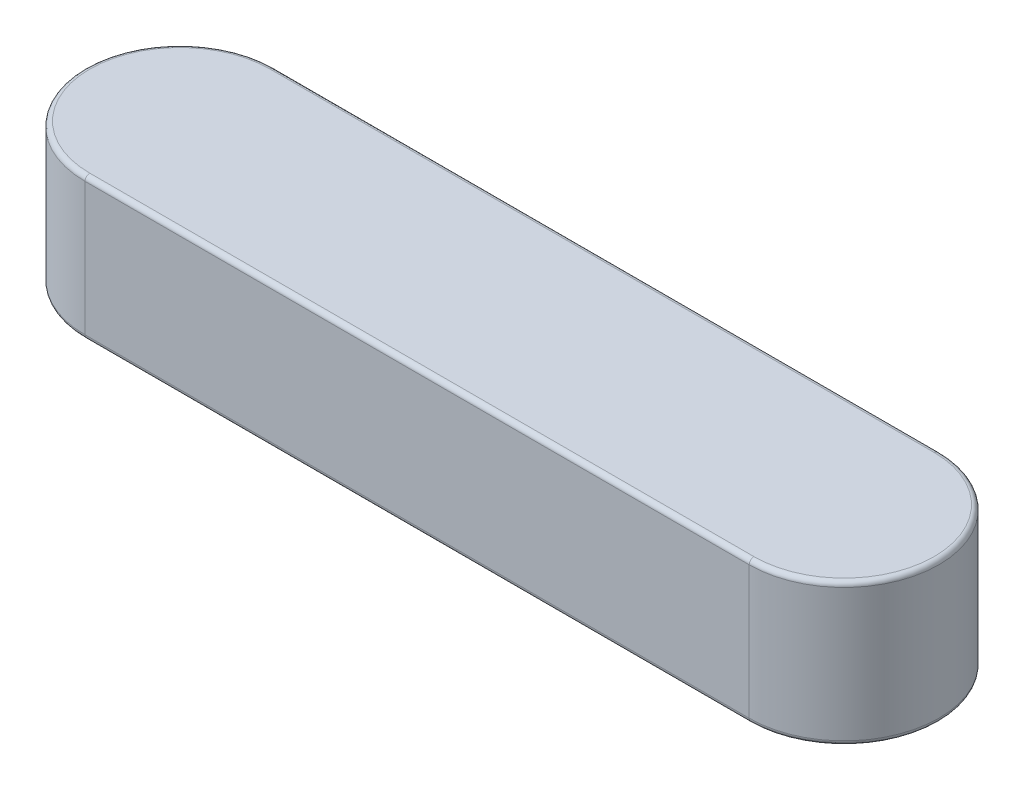
ISO-10303-21;
HEADER;
FILE_DESCRIPTION(('STEP AP214'),'2;1');
FILE_NAME('part.step','',(''),(''),'','','');
FILE_SCHEMA(('AUTOMOTIVE_DESIGN { 1 0 10303 214 1 1 1 1 }'));
ENDSEC;
DATA;
#1=APPLICATION_CONTEXT('core data for automotive mechanical design processes');
#2=APPLICATION_PROTOCOL_DEFINITION('international standard','automotive_design',2000,#1);
#3=PRODUCT_CONTEXT('',#1,'mechanical');
#4=PRODUCT('Part','Part','',(#3));
#5=PRODUCT_RELATED_PRODUCT_CATEGORY('part','',(#4));
#6=PRODUCT_DEFINITION_FORMATION('','',#4);
#7=PRODUCT_DEFINITION_CONTEXT('part definition',#1,'design');
#8=PRODUCT_DEFINITION('design','',#6,#7);
#9=PRODUCT_DEFINITION_SHAPE('','',#8);
#10=(LENGTH_UNIT() NAMED_UNIT(*) SI_UNIT(.MILLI.,.METRE.));
#11=(NAMED_UNIT(*) PLANE_ANGLE_UNIT() SI_UNIT($,.RADIAN.));
#12=(NAMED_UNIT(*) SI_UNIT($,.STERADIAN.) SOLID_ANGLE_UNIT());
#13=UNCERTAINTY_MEASURE_WITH_UNIT(LENGTH_MEASURE(1.E-05),#10,'distance_accuracy_value','');
#14=(GEOMETRIC_REPRESENTATION_CONTEXT(3) GLOBAL_UNCERTAINTY_ASSIGNED_CONTEXT((#13)) GLOBAL_UNIT_ASSIGNED_CONTEXT((#10,
#11,#12)) REPRESENTATION_CONTEXT('',''));
#15=CARTESIAN_POINT('',(0.,0.,0.));
#16=DIRECTION('',(0.,0.,1.));
#17=DIRECTION('',(1.,0.,0.));
#18=AXIS2_PLACEMENT_3D('',#15,#16,#17);
#19=CARTESIAN_POINT('',(-13.6061348843651,6.,0.));
#20=DIRECTION('',(0.,-1.,0.));
#21=DIRECTION('',(0.,0.,-1.));
#22=AXIS2_PLACEMENT_3D('',#19,#20,#21);
#23=CYLINDRICAL_SURFACE('',#22,4.);
#24=DIRECTION('',(0.,-1.,0.));
#25=VECTOR('',#24,1.);
#26=CARTESIAN_POINT('',(-13.6061348843651,6.,4.));
#27=LINE('',#26,#25);
#28=CARTESIAN_POINT('',(-13.6061348843651,5.8,4.));
#29=VERTEX_POINT('',#28);
#30=CARTESIAN_POINT('',(-13.6061348843651,0.2,4.));
#31=VERTEX_POINT('',#30);
#32=EDGE_CURVE('E126',#29,#31,#27,.T.);
#33=ORIENTED_EDGE('',*,*,#32,.F.);
#34=CARTESIAN_POINT('',(-13.6061348843651,5.8,0.));
#35=DIRECTION('',(0.,1.,0.));
#36=DIRECTION('',(0.,0.,1.));
#37=AXIS2_PLACEMENT_3D('',#34,#35,#36);
#38=CIRCLE('',#37,4.);
#39=CARTESIAN_POINT('',(-13.6061348843651,5.8,-4.));
#40=VERTEX_POINT('',#39);
#41=EDGE_CURVE('E11',#29,#40,#38,.F.);
#42=ORIENTED_EDGE('',*,*,#41,.T.);
#43=DIRECTION('',(0.,-1.,0.));
#44=VECTOR('',#43,1.);
#45=CARTESIAN_POINT('',(-13.6061348843651,6.,-4.));
#46=LINE('',#45,#44);
#47=CARTESIAN_POINT('',(-13.6061348843651,0.2,-4.));
#48=VERTEX_POINT('',#47);
#49=EDGE_CURVE('E131',#40,#48,#46,.T.);
#50=ORIENTED_EDGE('',*,*,#49,.T.);
#51=CARTESIAN_POINT('',(-13.6061348843651,0.2,0.));
#52=DIRECTION('',(0.,1.,0.));
#53=DIRECTION('',(0.,0.,1.));
#54=AXIS2_PLACEMENT_3D('',#51,#52,#53);
#55=CIRCLE('',#54,4.);
#56=EDGE_CURVE('E49',#48,#31,#55,.T.);
#57=ORIENTED_EDGE('',*,*,#56,.T.);
#58=EDGE_LOOP('',(#33,#42,#50,#57));
#59=FACE_BOUND('',#58,.T.);
#60=ADVANCED_FACE('F39',(#59),#23,.T.);
#61=CARTESIAN_POINT('',(-13.6061348843651,6.,4.));
#62=DIRECTION('',(0.,0.,-1.));
#63=DIRECTION('',(-1.,0.,0.));
#64=AXIS2_PLACEMENT_3D('',#61,#62,#63);
#65=PLANE('',#64);
#66=ORIENTED_EDGE('',*,*,#32,.T.);
#67=DIRECTION('',(1.,0.,0.));
#68=VECTOR('',#67,1.);
#69=CARTESIAN_POINT('',(-13.6061348843651,0.2,4.));
#70=LINE('',#69,#68);
#71=CARTESIAN_POINT('',(14.393865115635,0.2,4.));
#72=VERTEX_POINT('',#71);
#73=EDGE_CURVE('E177',#31,#72,#70,.T.);
#74=ORIENTED_EDGE('',*,*,#73,.T.);
#75=DIRECTION('',(0.,-1.,0.));
#76=VECTOR('',#75,1.);
#77=CARTESIAN_POINT('',(14.393865115635,6.,4.));
#78=LINE('',#77,#76);
#79=CARTESIAN_POINT('',(14.393865115635,5.8,4.));
#80=VERTEX_POINT('',#79);
#81=EDGE_CURVE('E142',#80,#72,#78,.T.);
#82=ORIENTED_EDGE('',*,*,#81,.F.);
#83=DIRECTION('',(1.,0.,0.));
#84=VECTOR('',#83,1.);
#85=CARTESIAN_POINT('',(-13.6061348843651,5.8,4.));
#86=LINE('',#85,#84);
#87=EDGE_CURVE('E174',#80,#29,#86,.F.);
#88=ORIENTED_EDGE('',*,*,#87,.T.);
#89=EDGE_LOOP('',(#66,#74,#82,#88));
#90=FACE_BOUND('',#89,.T.);
#91=ADVANCED_FACE('F216',(#90),#65,.F.);
#92=CARTESIAN_POINT('',(14.3938651156349,6.,0.));
#93=DIRECTION('',(0.,-1.,0.));
#94=DIRECTION('',(0.,0.,-1.));
#95=AXIS2_PLACEMENT_3D('',#92,#93,#94);
#96=CYLINDRICAL_SURFACE('',#95,4.);
#97=ORIENTED_EDGE('',*,*,#81,.T.);
#98=CARTESIAN_POINT('',(14.3938651156349,0.2,0.));
#99=DIRECTION('',(0.,1.,0.));
#100=DIRECTION('',(0.,0.,1.));
#101=AXIS2_PLACEMENT_3D('',#98,#99,#100);
#102=CIRCLE('',#101,4.);
#103=CARTESIAN_POINT('',(14.393865115635,0.2,-4.));
#104=VERTEX_POINT('',#103);
#105=EDGE_CURVE('E171',#72,#104,#102,.T.);
#106=ORIENTED_EDGE('',*,*,#105,.T.);
#107=DIRECTION('',(0.,-1.,0.));
#108=VECTOR('',#107,1.);
#109=CARTESIAN_POINT('',(14.393865115635,6.,-4.));
#110=LINE('',#109,#108);
#111=CARTESIAN_POINT('',(14.393865115635,5.8,-4.));
#112=VERTEX_POINT('',#111);
#113=EDGE_CURVE('E137',#112,#104,#110,.T.);
#114=ORIENTED_EDGE('',*,*,#113,.F.);
#115=CARTESIAN_POINT('',(14.3938651156349,5.8,0.));
#116=DIRECTION('',(0.,1.,0.));
#117=DIRECTION('',(0.,0.,1.));
#118=AXIS2_PLACEMENT_3D('',#115,#116,#117);
#119=CIRCLE('',#118,4.);
#120=EDGE_CURVE('E168',#112,#80,#119,.F.);
#121=ORIENTED_EDGE('',*,*,#120,.T.);
#122=EDGE_LOOP('',(#97,#106,#114,#121));
#123=FACE_BOUND('',#122,.T.);
#124=ADVANCED_FACE('F213',(#123),#96,.T.);
#125=CARTESIAN_POINT('',(-13.6061348843651,6.,-4.));
#126=DIRECTION('',(0.,0.,1.));
#127=DIRECTION('',(1.,0.,0.));
#128=AXIS2_PLACEMENT_3D('',#125,#126,#127);
#129=PLANE('',#128);
#130=ORIENTED_EDGE('',*,*,#113,.T.);
#131=DIRECTION('',(-1.,0.,0.));
#132=VECTOR('',#131,1.);
#133=CARTESIAN_POINT('',(-13.6061348843651,0.2,-4.));
#134=LINE('',#133,#132);
#135=EDGE_CURVE('E125',#104,#48,#134,.T.);
#136=ORIENTED_EDGE('',*,*,#135,.T.);
#137=ORIENTED_EDGE('',*,*,#49,.F.);
#138=DIRECTION('',(-1.,0.,0.));
#139=VECTOR('',#138,1.);
#140=CARTESIAN_POINT('',(14.393865115635,5.8,-4.));
#141=LINE('',#140,#139);
#142=EDGE_CURVE('E118',#40,#112,#141,.F.);
#143=ORIENTED_EDGE('',*,*,#142,.T.);
#144=EDGE_LOOP('',(#130,#136,#137,#143));
#145=FACE_BOUND('',#144,.T.);
#146=ADVANCED_FACE('F134',(#145),#129,.F.);
#147=CARTESIAN_POINT('',(-13.6061348843651,6.,0.));
#148=DIRECTION('',(0.,1.,0.));
#149=DIRECTION('',(0.,0.,1.));
#150=AXIS2_PLACEMENT_3D('',#147,#148,#149);
#151=PLANE('',#150);
#152=DIRECTION('',(-1.,0.,0.));
#153=VECTOR('',#152,1.);
#154=CARTESIAN_POINT('',(-13.6061348843651,6.,-3.8));
#155=LINE('',#154,#153);
#156=CARTESIAN_POINT('',(14.393865115635,6.,-3.8));
#157=VERTEX_POINT('',#156);
#158=CARTESIAN_POINT('',(-13.6061348843651,6.,-3.8));
#159=VERTEX_POINT('',#158);
#160=EDGE_CURVE('E57',#157,#159,#155,.T.);
#161=ORIENTED_EDGE('',*,*,#160,.T.);
#162=CARTESIAN_POINT('',(-13.6061348843651,6.,0.));
#163=DIRECTION('',(0.,1.,0.));
#164=DIRECTION('',(0.,0.,1.));
#165=AXIS2_PLACEMENT_3D('',#162,#163,#164);
#166=CIRCLE('',#165,3.8);
#167=CARTESIAN_POINT('',(-13.6061348843651,6.,3.8));
#168=VERTEX_POINT('',#167);
#169=EDGE_CURVE('E111',#159,#168,#166,.T.);
#170=ORIENTED_EDGE('',*,*,#169,.T.);
#171=DIRECTION('',(1.,0.,0.));
#172=VECTOR('',#171,1.);
#173=CARTESIAN_POINT('',(14.393865115635,6.,3.8));
#174=LINE('',#173,#172);
#175=CARTESIAN_POINT('',(14.393865115635,6.,3.8));
#176=VERTEX_POINT('',#175);
#177=EDGE_CURVE('E180',#168,#176,#174,.T.);
#178=ORIENTED_EDGE('',*,*,#177,.T.);
#179=CARTESIAN_POINT('',(14.3938651156349,6.,0.));
#180=DIRECTION('',(0.,1.,0.));
#181=DIRECTION('',(0.,0.,1.));
#182=AXIS2_PLACEMENT_3D('',#179,#180,#181);
#183=CIRCLE('',#182,3.8);
#184=EDGE_CURVE('E62',#176,#157,#183,.T.);
#185=ORIENTED_EDGE('',*,*,#184,.T.);
#186=EDGE_LOOP('',(#161,#170,#178,#185));
#187=FACE_BOUND('',#186,.T.);
#188=ADVANCED_FACE('F309',(#187),#151,.T.);
#189=CARTESIAN_POINT('',(-13.6061348843651,0.,0.));
#190=DIRECTION('',(0.,1.,0.));
#191=DIRECTION('',(0.,0.,1.));
#192=AXIS2_PLACEMENT_3D('',#189,#190,#191);
#193=PLANE('',#192);
#194=CARTESIAN_POINT('',(-13.6061348843651,0.,0.));
#195=DIRECTION('',(0.,1.,0.));
#196=DIRECTION('',(0.,0.,1.));
#197=AXIS2_PLACEMENT_3D('',#194,#195,#196);
#198=CIRCLE('',#197,3.8);
#199=CARTESIAN_POINT('',(-13.6061348843651,0.,3.8));
#200=VERTEX_POINT('',#199);
#201=CARTESIAN_POINT('',(-13.6061348843651,0.,-3.8));
#202=VERTEX_POINT('',#201);
#203=EDGE_CURVE('E155',#200,#202,#198,.F.);
#204=ORIENTED_EDGE('',*,*,#203,.T.);
#205=DIRECTION('',(-1.,0.,0.));
#206=VECTOR('',#205,1.);
#207=CARTESIAN_POINT('',(-13.6061348843651,0.,-3.8));
#208=LINE('',#207,#206);
#209=CARTESIAN_POINT('',(14.393865115635,0.,-3.8));
#210=VERTEX_POINT('',#209);
#211=EDGE_CURVE('E164',#202,#210,#208,.F.);
#212=ORIENTED_EDGE('',*,*,#211,.T.);
#213=CARTESIAN_POINT('',(14.3938651156349,0.,0.));
#214=DIRECTION('',(0.,1.,0.));
#215=DIRECTION('',(0.,0.,1.));
#216=AXIS2_PLACEMENT_3D('',#213,#214,#215);
#217=CIRCLE('',#216,3.8);
#218=CARTESIAN_POINT('',(14.393865115635,0.,3.8));
#219=VERTEX_POINT('',#218);
#220=EDGE_CURVE('E161',#210,#219,#217,.F.);
#221=ORIENTED_EDGE('',*,*,#220,.T.);
#222=DIRECTION('',(1.,0.,0.));
#223=VECTOR('',#222,1.);
#224=CARTESIAN_POINT('',(-13.6061348843651,0.,3.8));
#225=LINE('',#224,#223);
#226=EDGE_CURVE('E158',#219,#200,#225,.F.);
#227=ORIENTED_EDGE('',*,*,#226,.T.);
#228=EDGE_LOOP('',(#204,#212,#221,#227));
#229=FACE_BOUND('',#228,.T.);
#230=ADVANCED_FACE('F230',(#229),#193,.F.);
#231=CARTESIAN_POINT('',(-13.6061348843651,0.2,3.8));
#232=DIRECTION('',(1.,0.,0.));
#233=DIRECTION('',(0.,0.,-1.));
#234=AXIS2_PLACEMENT_3D('',#231,#232,#233);
#235=CYLINDRICAL_SURFACE('',#234,0.2);
#236=CARTESIAN_POINT('',(-13.6061348843651,0.2,3.8));
#237=DIRECTION('',(-1.,0.,0.));
#238=DIRECTION('',(0.,0.,1.));
#239=AXIS2_PLACEMENT_3D('',#236,#237,#238);
#240=CIRCLE('',#239,0.2);
#241=EDGE_CURVE('E145',#200,#31,#240,.T.);
#242=ORIENTED_EDGE('',*,*,#241,.F.);
#243=ORIENTED_EDGE('',*,*,#226,.F.);
#244=CARTESIAN_POINT('',(14.393865115635,0.2,3.8));
#245=DIRECTION('',(1.,0.,0.));
#246=DIRECTION('',(0.,0.,-1.));
#247=AXIS2_PLACEMENT_3D('',#244,#245,#246);
#248=CIRCLE('',#247,0.2);
#249=EDGE_CURVE('E138',#72,#219,#248,.T.);
#250=ORIENTED_EDGE('',*,*,#249,.F.);
#251=ORIENTED_EDGE('',*,*,#73,.F.);
#252=EDGE_LOOP('',(#242,#243,#250,#251));
#253=FACE_BOUND('',#252,.T.);
#254=ADVANCED_FACE('F220',(#253),#235,.T.);
#255=CARTESIAN_POINT('',(14.3938651156349,0.2,0.));
#256=DIRECTION('',(0.,1.,0.));
#257=DIRECTION('',(0.,0.,1.));
#258=AXIS2_PLACEMENT_3D('',#255,#256,#257);
#259=TOROIDAL_SURFACE('',#258,3.8,0.2);
#260=ORIENTED_EDGE('',*,*,#249,.T.);
#261=ORIENTED_EDGE('',*,*,#220,.F.);
#262=CARTESIAN_POINT('',(14.393865115635,0.2,-3.8));
#263=DIRECTION('',(-1.,0.,0.));
#264=DIRECTION('',(0.,0.,1.));
#265=AXIS2_PLACEMENT_3D('',#262,#263,#264);
#266=CIRCLE('',#265,0.2);
#267=EDGE_CURVE('E194',#104,#210,#266,.T.);
#268=ORIENTED_EDGE('',*,*,#267,.F.);
#269=ORIENTED_EDGE('',*,*,#105,.F.);
#270=EDGE_LOOP('',(#260,#261,#268,#269));
#271=FACE_BOUND('',#270,.T.);
#272=ADVANCED_FACE('F236',(#271),#259,.T.);
#273=CARTESIAN_POINT('',(-13.6061348843651,0.2,0.));
#274=DIRECTION('',(0.,1.,0.));
#275=DIRECTION('',(0.,0.,1.));
#276=AXIS2_PLACEMENT_3D('',#273,#274,#275);
#277=TOROIDAL_SURFACE('',#276,3.8,0.2);
#278=ORIENTED_EDGE('',*,*,#241,.T.);
#279=ORIENTED_EDGE('',*,*,#56,.F.);
#280=CARTESIAN_POINT('',(-13.6061348843651,0.2,-3.8));
#281=DIRECTION('',(1.,0.,0.));
#282=DIRECTION('',(0.,0.,-1.));
#283=AXIS2_PLACEMENT_3D('',#280,#281,#282);
#284=CIRCLE('',#283,0.2);
#285=EDGE_CURVE('E191',#202,#48,#284,.T.);
#286=ORIENTED_EDGE('',*,*,#285,.F.);
#287=ORIENTED_EDGE('',*,*,#203,.F.);
#288=EDGE_LOOP('',(#278,#279,#286,#287));
#289=FACE_BOUND('',#288,.T.);
#290=ADVANCED_FACE('F226',(#289),#277,.T.);
#291=CARTESIAN_POINT('',(-13.6061348843651,0.2,-3.8));
#292=DIRECTION('',(-1.,0.,0.));
#293=DIRECTION('',(0.,0.,1.));
#294=AXIS2_PLACEMENT_3D('',#291,#292,#293);
#295=CYLINDRICAL_SURFACE('',#294,0.2);
#296=ORIENTED_EDGE('',*,*,#267,.T.);
#297=ORIENTED_EDGE('',*,*,#211,.F.);
#298=ORIENTED_EDGE('',*,*,#285,.T.);
#299=ORIENTED_EDGE('',*,*,#135,.F.);
#300=EDGE_LOOP('',(#296,#297,#298,#299));
#301=FACE_BOUND('',#300,.T.);
#302=ADVANCED_FACE('F232',(#301),#295,.T.);
#303=CARTESIAN_POINT('',(14.3938651156349,5.8,0.));
#304=DIRECTION('',(0.,1.,0.));
#305=DIRECTION('',(0.,0.,1.));
#306=AXIS2_PLACEMENT_3D('',#303,#304,#305);
#307=TOROIDAL_SURFACE('',#306,3.8,0.2);
#308=CARTESIAN_POINT('',(14.393865115635,5.8,3.8));
#309=DIRECTION('',(-1.,0.,0.));
#310=DIRECTION('',(0.,0.,1.));
#311=AXIS2_PLACEMENT_3D('',#308,#309,#310);
#312=CIRCLE('',#311,0.2);
#313=EDGE_CURVE('E114',#80,#176,#312,.T.);
#314=ORIENTED_EDGE('',*,*,#313,.F.);
#315=ORIENTED_EDGE('',*,*,#120,.F.);
#316=CARTESIAN_POINT('',(14.393865115635,5.8,-3.8));
#317=DIRECTION('',(-1.,0.,0.));
#318=DIRECTION('',(0.,0.,1.));
#319=AXIS2_PLACEMENT_3D('',#316,#317,#318);
#320=CIRCLE('',#319,0.2);
#321=EDGE_CURVE('E43',#157,#112,#320,.T.);
#322=ORIENTED_EDGE('',*,*,#321,.F.);
#323=ORIENTED_EDGE('',*,*,#184,.F.);
#324=EDGE_LOOP('',(#314,#315,#322,#323));
#325=FACE_BOUND('',#324,.T.);
#326=ADVANCED_FACE('F41',(#325),#307,.T.);
#327=CARTESIAN_POINT('',(-13.6061348843651,5.8,-3.8));
#328=DIRECTION('',(1.,0.,0.));
#329=DIRECTION('',(0.,0.,-1.));
#330=AXIS2_PLACEMENT_3D('',#327,#328,#329);
#331=CYLINDRICAL_SURFACE('',#330,0.2);
#332=ORIENTED_EDGE('',*,*,#321,.T.);
#333=ORIENTED_EDGE('',*,*,#142,.F.);
#334=CARTESIAN_POINT('',(-13.6061348843651,5.8,-3.8));
#335=DIRECTION('',(-1.,0.,0.));
#336=DIRECTION('',(0.,0.,1.));
#337=AXIS2_PLACEMENT_3D('',#334,#335,#336);
#338=CIRCLE('',#337,0.2);
#339=EDGE_CURVE('E107',#159,#40,#338,.T.);
#340=ORIENTED_EDGE('',*,*,#339,.F.);
#341=ORIENTED_EDGE('',*,*,#160,.F.);
#342=EDGE_LOOP('',(#332,#333,#340,#341));
#343=FACE_BOUND('',#342,.T.);
#344=ADVANCED_FACE('F119',(#343),#331,.T.);
#345=CARTESIAN_POINT('',(-13.6061348843651,5.8,3.8));
#346=DIRECTION('',(-1.,0.,0.));
#347=DIRECTION('',(0.,0.,1.));
#348=AXIS2_PLACEMENT_3D('',#345,#346,#347);
#349=CYLINDRICAL_SURFACE('',#348,0.2);
#350=ORIENTED_EDGE('',*,*,#313,.T.);
#351=ORIENTED_EDGE('',*,*,#177,.F.);
#352=CARTESIAN_POINT('',(-13.6061348843651,5.8,3.8));
#353=DIRECTION('',(-1.,0.,0.));
#354=DIRECTION('',(0.,0.,1.));
#355=AXIS2_PLACEMENT_3D('',#352,#353,#354);
#356=CIRCLE('',#355,0.2);
#357=EDGE_CURVE('E115',#29,#168,#356,.T.);
#358=ORIENTED_EDGE('',*,*,#357,.F.);
#359=ORIENTED_EDGE('',*,*,#87,.F.);
#360=EDGE_LOOP('',(#350,#351,#358,#359));
#361=FACE_BOUND('',#360,.T.);
#362=ADVANCED_FACE('F208',(#361),#349,.T.);
#363=CARTESIAN_POINT('',(-13.6061348843651,5.8,0.));
#364=DIRECTION('',(0.,1.,0.));
#365=DIRECTION('',(0.,0.,1.));
#366=AXIS2_PLACEMENT_3D('',#363,#364,#365);
#367=TOROIDAL_SURFACE('',#366,3.8,0.2);
#368=ORIENTED_EDGE('',*,*,#339,.T.);
#369=ORIENTED_EDGE('',*,*,#41,.F.);
#370=ORIENTED_EDGE('',*,*,#357,.T.);
#371=ORIENTED_EDGE('',*,*,#169,.F.);
#372=EDGE_LOOP('',(#368,#369,#370,#371));
#373=FACE_BOUND('',#372,.T.);
#374=ADVANCED_FACE('F109',(#373),#367,.T.);
#375=CLOSED_SHELL('',(#60,#91,#124,#146,#188,#230,#254,#272,#290,#302,#326,#344,#362,#374));
#376=MANIFOLD_SOLID_BREP('B2',#375);
#377=ADVANCED_BREP_SHAPE_REPRESENTATION('',(#18,#376),#14);
#378=SHAPE_DEFINITION_REPRESENTATION(#9,#377);
ENDSEC;
END-ISO-10303-21;
